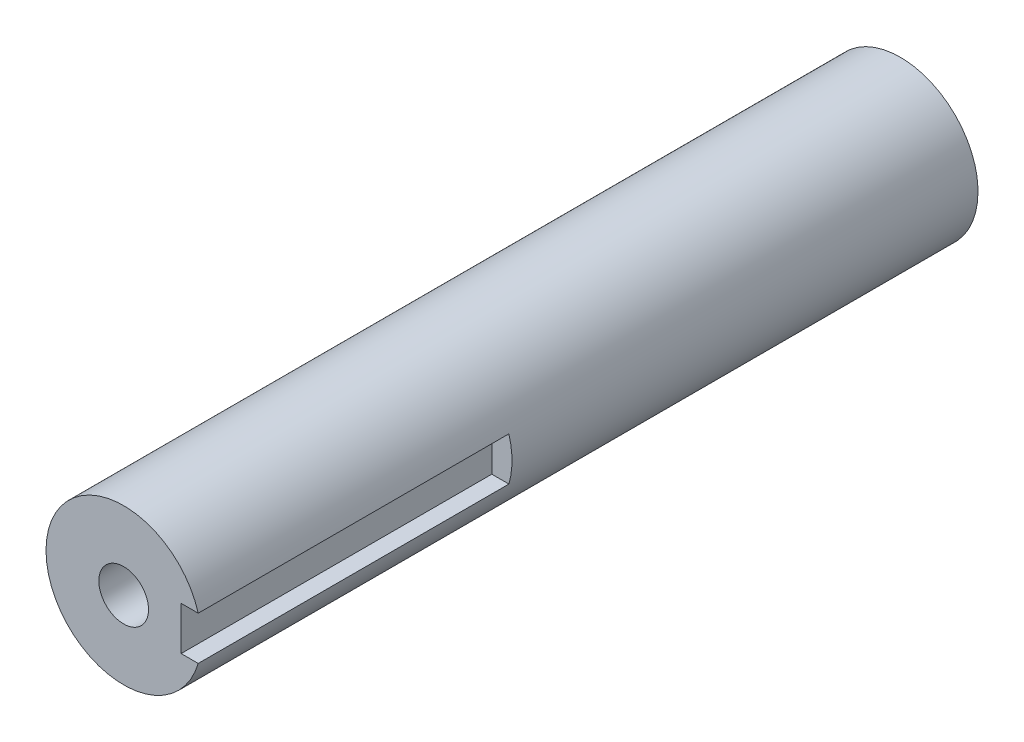
ISO-10303-21;
HEADER;
FILE_DESCRIPTION(('STEP AP214'),'2;1');
FILE_NAME('part.step','',(''),(''),'','','');
FILE_SCHEMA(('AUTOMOTIVE_DESIGN { 1 0 10303 214 1 1 1 1 }'));
ENDSEC;
DATA;
#1=APPLICATION_CONTEXT('core data for automotive mechanical design processes');
#2=APPLICATION_PROTOCOL_DEFINITION('international standard','automotive_design',2000,#1);
#3=PRODUCT_CONTEXT('',#1,'mechanical');
#4=PRODUCT('Part','Part','',(#3));
#5=PRODUCT_RELATED_PRODUCT_CATEGORY('part','',(#4));
#6=PRODUCT_DEFINITION_FORMATION('','',#4);
#7=PRODUCT_DEFINITION_CONTEXT('part definition',#1,'design');
#8=PRODUCT_DEFINITION('design','',#6,#7);
#9=PRODUCT_DEFINITION_SHAPE('','',#8);
#10=(LENGTH_UNIT() NAMED_UNIT(*) SI_UNIT(.MILLI.,.METRE.));
#11=(NAMED_UNIT(*) PLANE_ANGLE_UNIT() SI_UNIT($,.RADIAN.));
#12=(NAMED_UNIT(*) SI_UNIT($,.STERADIAN.) SOLID_ANGLE_UNIT());
#13=UNCERTAINTY_MEASURE_WITH_UNIT(LENGTH_MEASURE(1.E-05),#10,'distance_accuracy_value','');
#14=(GEOMETRIC_REPRESENTATION_CONTEXT(3) GLOBAL_UNCERTAINTY_ASSIGNED_CONTEXT((#13)) GLOBAL_UNIT_ASSIGNED_CONTEXT((#10,
#11,#12)) REPRESENTATION_CONTEXT('',''));
#15=CARTESIAN_POINT('',(0.,0.,0.));
#16=DIRECTION('',(0.,0.,1.));
#17=DIRECTION('',(1.,0.,0.));
#18=AXIS2_PLACEMENT_3D('',#15,#16,#17);
#19=CARTESIAN_POINT('',(0.,0.,250.));
#20=DIRECTION('',(0.,0.,-1.));
#21=DIRECTION('',(-1.,0.,0.));
#22=AXIS2_PLACEMENT_3D('',#19,#20,#21);
#23=CYLINDRICAL_SURFACE('',#22,25.);
#24=CARTESIAN_POINT('',(0.,0.,250.));
#25=DIRECTION('',(0.,0.,1.));
#26=DIRECTION('',(1.,0.,0.));
#27=AXIS2_PLACEMENT_3D('',#24,#25,#26);
#28=CIRCLE('',#27,25.);
#29=CARTESIAN_POINT('',(24.,7.,250.));
#30=VERTEX_POINT('',#29);
#31=CARTESIAN_POINT('',(24.,-7.,250.));
#32=VERTEX_POINT('',#31);
#33=EDGE_CURVE('E103',#30,#32,#28,.T.);
#34=ORIENTED_EDGE('',*,*,#33,.F.);
#35=DIRECTION('',(0.,0.,-1.));
#36=VECTOR('',#35,1.);
#37=CARTESIAN_POINT('',(24.,7.,250.));
#38=LINE('',#37,#36);
#39=CARTESIAN_POINT('',(24.,7.,150.));
#40=VERTEX_POINT('',#39);
#41=EDGE_CURVE('E100',#30,#40,#38,.T.);
#42=ORIENTED_EDGE('',*,*,#41,.T.);
#43=CARTESIAN_POINT('',(0.,0.,150.));
#44=DIRECTION('',(0.,0.,1.));
#45=DIRECTION('',(1.,0.,0.));
#46=AXIS2_PLACEMENT_3D('',#43,#44,#45);
#47=CIRCLE('',#46,25.);
#48=CARTESIAN_POINT('',(24.,-7.,150.));
#49=VERTEX_POINT('',#48);
#50=EDGE_CURVE('E11',#49,#40,#47,.T.);
#51=ORIENTED_EDGE('',*,*,#50,.F.);
#52=DIRECTION('',(0.,0.,-1.));
#53=VECTOR('',#52,1.);
#54=CARTESIAN_POINT('',(24.,-7.,250.));
#55=LINE('',#54,#53);
#56=EDGE_CURVE('E96',#49,#32,#55,.F.);
#57=ORIENTED_EDGE('',*,*,#56,.T.);
#58=EDGE_LOOP('',(#34,#42,#51,#57));
#59=FACE_BOUND('',#58,.T.);
#60=CARTESIAN_POINT('',(0.,0.,0.));
#61=DIRECTION('',(0.,0.,1.));
#62=DIRECTION('',(1.,0.,0.));
#63=AXIS2_PLACEMENT_3D('',#60,#61,#62);
#64=CIRCLE('',#63,25.);
#65=CARTESIAN_POINT('',(25.,0.,0.));
#66=VERTEX_POINT('',#65);
#67=EDGE_CURVE('E102',#66,#66,#64,.T.);
#68=ORIENTED_EDGE('',*,*,#67,.T.);
#69=EDGE_LOOP('',(#68));
#70=FACE_BOUND('',#69,.T.);
#71=ADVANCED_FACE('F34',(#59,#70),#23,.T.);
#72=CARTESIAN_POINT('',(0.,0.,250.));
#73=DIRECTION('',(0.,0.,1.));
#74=DIRECTION('',(1.,0.,0.));
#75=AXIS2_PLACEMENT_3D('',#72,#73,#74);
#76=PLANE('',#75);
#77=CARTESIAN_POINT('',(0.,0.,250.));
#78=DIRECTION('',(0.,0.,1.));
#79=DIRECTION('',(1.,0.,0.));
#80=AXIS2_PLACEMENT_3D('',#77,#78,#79);
#81=CIRCLE('',#80,8.);
#82=CARTESIAN_POINT('',(8.,0.,250.));
#83=VERTEX_POINT('',#82);
#84=EDGE_CURVE('E149',#83,#83,#81,.T.);
#85=ORIENTED_EDGE('',*,*,#84,.F.);
#86=EDGE_LOOP('',(#85));
#87=FACE_BOUND('',#86,.T.);
#88=DIRECTION('',(-1.,0.,0.));
#89=VECTOR('',#88,1.);
#90=CARTESIAN_POINT('',(0.,7.,250.));
#91=LINE('',#90,#89);
#92=CARTESIAN_POINT('',(18.5,7.,250.));
#93=VERTEX_POINT('',#92);
#94=EDGE_CURVE('E41',#30,#93,#91,.T.);
#95=ORIENTED_EDGE('',*,*,#94,.F.);
#96=ORIENTED_EDGE('',*,*,#33,.T.);
#97=DIRECTION('',(1.,0.,0.));
#98=VECTOR('',#97,1.);
#99=CARTESIAN_POINT('',(28.5,-7.,250.));
#100=LINE('',#99,#98);
#101=CARTESIAN_POINT('',(18.5,-7.,250.));
#102=VERTEX_POINT('',#101);
#103=EDGE_CURVE('E78',#102,#32,#100,.T.);
#104=ORIENTED_EDGE('',*,*,#103,.F.);
#105=DIRECTION('',(0.,-1.,0.));
#106=VECTOR('',#105,1.);
#107=CARTESIAN_POINT('',(18.5,7.,250.));
#108=LINE('',#107,#106);
#109=EDGE_CURVE('E92',#93,#102,#108,.T.);
#110=ORIENTED_EDGE('',*,*,#109,.F.);
#111=EDGE_LOOP('',(#95,#96,#104,#110));
#112=FACE_BOUND('',#111,.T.);
#113=ADVANCED_FACE('F112',(#87,#112),#76,.T.);
#114=CARTESIAN_POINT('',(0.,0.,0.));
#115=DIRECTION('',(0.,0.,1.));
#116=DIRECTION('',(1.,0.,0.));
#117=AXIS2_PLACEMENT_3D('',#114,#115,#116);
#118=PLANE('',#117);
#119=ORIENTED_EDGE('',*,*,#67,.F.);
#120=EDGE_LOOP('',(#119));
#121=FACE_BOUND('',#120,.T.);
#122=ADVANCED_FACE('F110',(#121),#118,.F.);
#123=CARTESIAN_POINT('',(0.,0.,150.));
#124=DIRECTION('',(0.,0.,1.));
#125=DIRECTION('',(1.,0.,0.));
#126=AXIS2_PLACEMENT_3D('',#123,#124,#125);
#127=PLANE('',#126);
#128=ORIENTED_EDGE('',*,*,#50,.T.);
#129=DIRECTION('',(-1.,0.,0.));
#130=VECTOR('',#129,1.);
#131=CARTESIAN_POINT('',(28.5,7.,150.));
#132=LINE('',#131,#130);
#133=CARTESIAN_POINT('',(18.5,7.,150.));
#134=VERTEX_POINT('',#133);
#135=EDGE_CURVE('E73',#40,#134,#132,.T.);
#136=ORIENTED_EDGE('',*,*,#135,.T.);
#137=DIRECTION('',(0.,-1.,0.));
#138=VECTOR('',#137,1.);
#139=CARTESIAN_POINT('',(18.5,7.,150.));
#140=LINE('',#139,#138);
#141=CARTESIAN_POINT('',(18.5,-7.,150.));
#142=VERTEX_POINT('',#141);
#143=EDGE_CURVE('E75',#134,#142,#140,.T.);
#144=ORIENTED_EDGE('',*,*,#143,.T.);
#145=DIRECTION('',(1.,0.,0.));
#146=VECTOR('',#145,1.);
#147=CARTESIAN_POINT('',(28.5,-7.,150.));
#148=LINE('',#147,#146);
#149=EDGE_CURVE('E84',#142,#49,#148,.T.);
#150=ORIENTED_EDGE('',*,*,#149,.T.);
#151=EDGE_LOOP('',(#128,#136,#144,#150));
#152=FACE_BOUND('',#151,.T.);
#153=ADVANCED_FACE('F74',(#152),#127,.T.);
#154=CARTESIAN_POINT('',(28.5,7.,150.));
#155=DIRECTION('',(0.,1.,0.));
#156=DIRECTION('',(-1.,0.,0.));
#157=AXIS2_PLACEMENT_3D('',#154,#155,#156);
#158=PLANE('',#157);
#159=ORIENTED_EDGE('',*,*,#94,.T.);
#160=DIRECTION('',(0.,0.,1.));
#161=VECTOR('',#160,1.);
#162=CARTESIAN_POINT('',(18.5,7.,150.));
#163=LINE('',#162,#161);
#164=EDGE_CURVE('E48',#134,#93,#163,.T.);
#165=ORIENTED_EDGE('',*,*,#164,.F.);
#166=ORIENTED_EDGE('',*,*,#135,.F.);
#167=ORIENTED_EDGE('',*,*,#41,.F.);
#168=EDGE_LOOP('',(#159,#165,#166,#167));
#169=FACE_BOUND('',#168,.T.);
#170=ADVANCED_FACE('F80',(#169),#158,.F.);
#171=CARTESIAN_POINT('',(28.5,-7.,150.));
#172=DIRECTION('',(0.,-1.,0.));
#173=DIRECTION('',(0.,0.,-1.));
#174=AXIS2_PLACEMENT_3D('',#171,#172,#173);
#175=PLANE('',#174);
#176=ORIENTED_EDGE('',*,*,#149,.F.);
#177=DIRECTION('',(0.,0.,1.));
#178=VECTOR('',#177,1.);
#179=CARTESIAN_POINT('',(18.5,-7.,150.));
#180=LINE('',#179,#178);
#181=EDGE_CURVE('E83',#142,#102,#180,.T.);
#182=ORIENTED_EDGE('',*,*,#181,.T.);
#183=ORIENTED_EDGE('',*,*,#103,.T.);
#184=ORIENTED_EDGE('',*,*,#56,.F.);
#185=EDGE_LOOP('',(#176,#182,#183,#184));
#186=FACE_BOUND('',#185,.T.);
#187=ADVANCED_FACE('F128',(#186),#175,.F.);
#188=CARTESIAN_POINT('',(18.5,7.,150.));
#189=DIRECTION('',(-1.,0.,0.));
#190=DIRECTION('',(0.,0.,1.));
#191=AXIS2_PLACEMENT_3D('',#188,#189,#190);
#192=PLANE('',#191);
#193=ORIENTED_EDGE('',*,*,#109,.T.);
#194=ORIENTED_EDGE('',*,*,#181,.F.);
#195=ORIENTED_EDGE('',*,*,#143,.F.);
#196=ORIENTED_EDGE('',*,*,#164,.T.);
#197=EDGE_LOOP('',(#193,#194,#195,#196));
#198=FACE_BOUND('',#197,.T.);
#199=ADVANCED_FACE('F86',(#198),#192,.F.);
#200=CARTESIAN_POINT('',(0.,0.,210.));
#201=DIRECTION('',(0.,0.,1.));
#202=DIRECTION('',(1.,0.,0.));
#203=AXIS2_PLACEMENT_3D('',#200,#201,#202);
#204=CYLINDRICAL_SURFACE('',#203,8.);
#205=CARTESIAN_POINT('',(0.,0.,210.));
#206=DIRECTION('',(0.,0.,1.));
#207=DIRECTION('',(1.,0.,0.));
#208=AXIS2_PLACEMENT_3D('',#205,#206,#207);
#209=CIRCLE('',#208,8.);
#210=CARTESIAN_POINT('',(8.,0.,210.));
#211=VERTEX_POINT('',#210);
#212=EDGE_CURVE('E94',#211,#211,#209,.T.);
#213=ORIENTED_EDGE('',*,*,#212,.F.);
#214=EDGE_LOOP('',(#213));
#215=FACE_BOUND('',#214,.T.);
#216=ORIENTED_EDGE('',*,*,#84,.T.);
#217=EDGE_LOOP('',(#216));
#218=FACE_BOUND('',#217,.T.);
#219=ADVANCED_FACE('F135',(#215,#218),#204,.F.);
#220=CARTESIAN_POINT('',(0.,0.,210.));
#221=DIRECTION('',(0.,0.,1.));
#222=DIRECTION('',(1.,0.,0.));
#223=AXIS2_PLACEMENT_3D('',#220,#221,#222);
#224=PLANE('',#223);
#225=ORIENTED_EDGE('',*,*,#212,.T.);
#226=EDGE_LOOP('',(#225));
#227=FACE_BOUND('',#226,.T.);
#228=ADVANCED_FACE('F141',(#227),#224,.T.);
#229=CLOSED_SHELL('',(#71,#113,#122,#153,#170,#187,#199,#219,#228));
#230=MANIFOLD_SOLID_BREP('B2',#229);
#231=ADVANCED_BREP_SHAPE_REPRESENTATION('',(#18,#230),#14);
#232=SHAPE_DEFINITION_REPRESENTATION(#9,#231);
ENDSEC;
END-ISO-10303-21;
